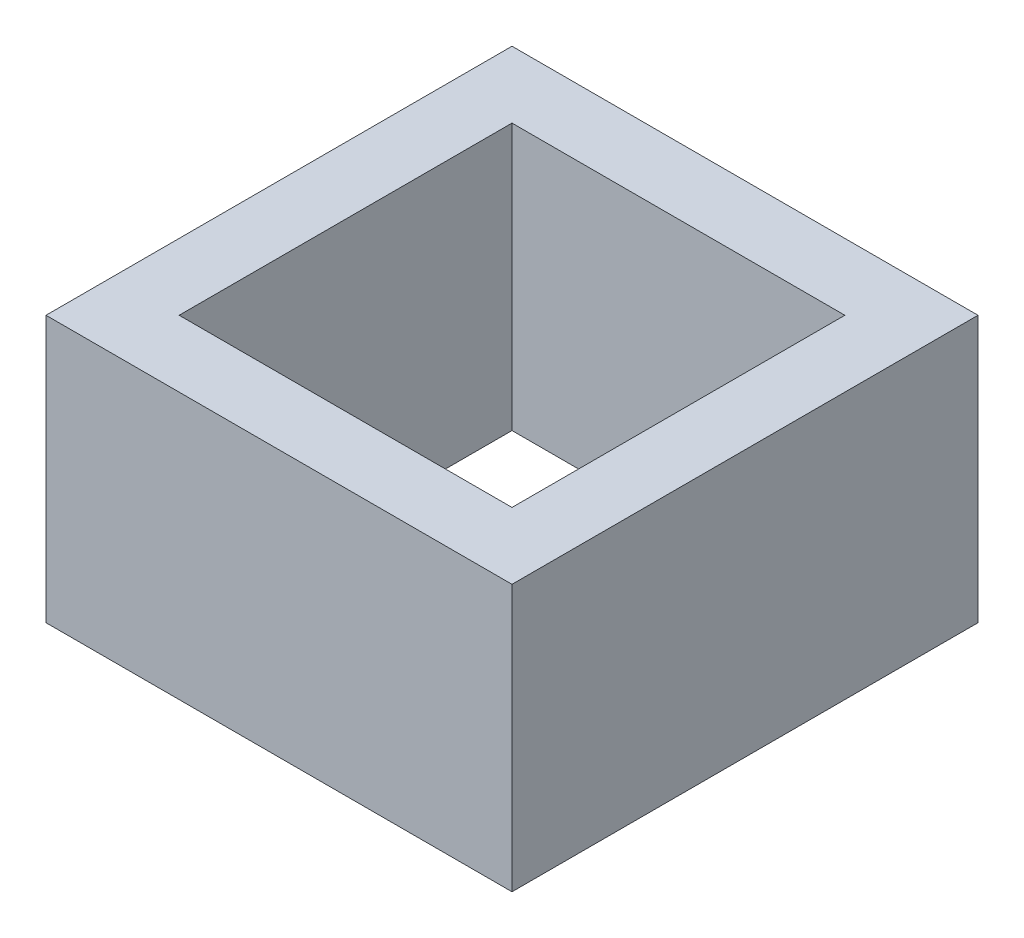
ISO-10303-21;
HEADER;
FILE_DESCRIPTION(('STEP AP214'),'2;1');
FILE_NAME('part.step','',(''),(''),'','','');
FILE_SCHEMA(('AUTOMOTIVE_DESIGN { 1 0 10303 214 1 1 1 1 }'));
ENDSEC;
DATA;
#1=APPLICATION_CONTEXT('core data for automotive mechanical design processes');
#2=APPLICATION_PROTOCOL_DEFINITION('international standard','automotive_design',2000,#1);
#3=PRODUCT_CONTEXT('',#1,'mechanical');
#4=PRODUCT('Part','Part','',(#3));
#5=PRODUCT_RELATED_PRODUCT_CATEGORY('part','',(#4));
#6=PRODUCT_DEFINITION_FORMATION('','',#4);
#7=PRODUCT_DEFINITION_CONTEXT('part definition',#1,'design');
#8=PRODUCT_DEFINITION('design','',#6,#7);
#9=PRODUCT_DEFINITION_SHAPE('','',#8);
#10=(LENGTH_UNIT() NAMED_UNIT(*) SI_UNIT(.MILLI.,.METRE.));
#11=(NAMED_UNIT(*) PLANE_ANGLE_UNIT() SI_UNIT($,.RADIAN.));
#12=(NAMED_UNIT(*) SI_UNIT($,.STERADIAN.) SOLID_ANGLE_UNIT());
#13=UNCERTAINTY_MEASURE_WITH_UNIT(LENGTH_MEASURE(1.E-05),#10,'distance_accuracy_value','');
#14=(GEOMETRIC_REPRESENTATION_CONTEXT(3) GLOBAL_UNCERTAINTY_ASSIGNED_CONTEXT((#13)) GLOBAL_UNIT_ASSIGNED_CONTEXT((#10,
#11,#12)) REPRESENTATION_CONTEXT('',''));
#15=CARTESIAN_POINT('',(0.,0.,0.));
#16=DIRECTION('',(0.,0.,1.));
#17=DIRECTION('',(1.,0.,0.));
#18=AXIS2_PLACEMENT_3D('',#15,#16,#17);
#19=CARTESIAN_POINT('',(0.,20.,0.));
#20=DIRECTION('',(0.,1.,0.));
#21=DIRECTION('',(0.,0.,1.));
#22=AXIS2_PLACEMENT_3D('',#19,#20,#21);
#23=PLANE('',#22);
#24=DIRECTION('',(0.,0.,-1.));
#25=VECTOR('',#24,1.);
#26=CARTESIAN_POINT('',(17.5,20.,-17.5));
#27=LINE('',#26,#25);
#28=CARTESIAN_POINT('',(17.5,20.,17.5));
#29=VERTEX_POINT('',#28);
#30=CARTESIAN_POINT('',(17.5,20.,-17.5));
#31=VERTEX_POINT('',#30);
#32=EDGE_CURVE('E134',#29,#31,#27,.T.);
#33=ORIENTED_EDGE('',*,*,#32,.T.);
#34=DIRECTION('',(-1.,0.,0.));
#35=VECTOR('',#34,1.);
#36=CARTESIAN_POINT('',(-17.5,20.,-17.5));
#37=LINE('',#36,#35);
#38=CARTESIAN_POINT('',(-17.5,20.,-17.5));
#39=VERTEX_POINT('',#38);
#40=EDGE_CURVE('E137',#31,#39,#37,.T.);
#41=ORIENTED_EDGE('',*,*,#40,.T.);
#42=DIRECTION('',(0.,0.,1.));
#43=VECTOR('',#42,1.);
#44=CARTESIAN_POINT('',(-17.5,20.,-17.5));
#45=LINE('',#44,#43);
#46=CARTESIAN_POINT('',(-17.5,20.,17.5));
#47=VERTEX_POINT('',#46);
#48=EDGE_CURVE('E140',#39,#47,#45,.T.);
#49=ORIENTED_EDGE('',*,*,#48,.T.);
#50=DIRECTION('',(1.,0.,0.));
#51=VECTOR('',#50,1.);
#52=CARTESIAN_POINT('',(-17.5,20.,17.5));
#53=LINE('',#52,#51);
#54=EDGE_CURVE('E142',#47,#29,#53,.T.);
#55=ORIENTED_EDGE('',*,*,#54,.T.);
#56=EDGE_LOOP('',(#33,#41,#49,#55));
#57=FACE_BOUND('',#56,.T.);
#58=DIRECTION('',(-1.,0.,0.));
#59=VECTOR('',#58,1.);
#60=CARTESIAN_POINT('',(-12.5,20.,-12.5));
#61=LINE('',#60,#59);
#62=CARTESIAN_POINT('',(12.5,20.,-12.5));
#63=VERTEX_POINT('',#62);
#64=CARTESIAN_POINT('',(-12.5,20.,-12.5));
#65=VERTEX_POINT('',#64);
#66=EDGE_CURVE('E106',#63,#65,#61,.T.);
#67=ORIENTED_EDGE('',*,*,#66,.F.);
#68=DIRECTION('',(0.,0.,-1.));
#69=VECTOR('',#68,1.);
#70=CARTESIAN_POINT('',(12.5,20.,-12.5));
#71=LINE('',#70,#69);
#72=CARTESIAN_POINT('',(12.5,20.,12.5));
#73=VERTEX_POINT('',#72);
#74=EDGE_CURVE('E98',#73,#63,#71,.T.);
#75=ORIENTED_EDGE('',*,*,#74,.F.);
#76=DIRECTION('',(1.,0.,0.));
#77=VECTOR('',#76,1.);
#78=CARTESIAN_POINT('',(-12.5,20.,12.5));
#79=LINE('',#78,#77);
#80=CARTESIAN_POINT('',(-12.5,20.,12.5));
#81=VERTEX_POINT('',#80);
#82=EDGE_CURVE('E120',#81,#73,#79,.T.);
#83=ORIENTED_EDGE('',*,*,#82,.F.);
#84=DIRECTION('',(0.,0.,1.));
#85=VECTOR('',#84,1.);
#86=CARTESIAN_POINT('',(-12.5,20.,-12.5));
#87=LINE('',#86,#85);
#88=EDGE_CURVE('E118',#65,#81,#87,.T.);
#89=ORIENTED_EDGE('',*,*,#88,.F.);
#90=EDGE_LOOP('',(#67,#75,#83,#89));
#91=FACE_BOUND('',#90,.T.);
#92=ADVANCED_FACE('F33',(#57,#91),#23,.T.);
#93=CARTESIAN_POINT('',(0.,0.,0.));
#94=DIRECTION('',(0.,1.,0.));
#95=DIRECTION('',(0.,0.,1.));
#96=AXIS2_PLACEMENT_3D('',#93,#94,#95);
#97=PLANE('',#96);
#98=DIRECTION('',(0.,0.,-1.));
#99=VECTOR('',#98,1.);
#100=CARTESIAN_POINT('',(17.5,0.,-17.5));
#101=LINE('',#100,#99);
#102=CARTESIAN_POINT('',(17.5,0.,17.5));
#103=VERTEX_POINT('',#102);
#104=CARTESIAN_POINT('',(17.5,0.,-17.5));
#105=VERTEX_POINT('',#104);
#106=EDGE_CURVE('E114',#103,#105,#101,.T.);
#107=ORIENTED_EDGE('',*,*,#106,.F.);
#108=DIRECTION('',(1.,0.,0.));
#109=VECTOR('',#108,1.);
#110=CARTESIAN_POINT('',(-17.5,0.,17.5));
#111=LINE('',#110,#109);
#112=CARTESIAN_POINT('',(-17.5,0.,17.5));
#113=VERTEX_POINT('',#112);
#114=EDGE_CURVE('E138',#113,#103,#111,.T.);
#115=ORIENTED_EDGE('',*,*,#114,.F.);
#116=DIRECTION('',(0.,0.,1.));
#117=VECTOR('',#116,1.);
#118=CARTESIAN_POINT('',(-17.5,0.,-17.5));
#119=LINE('',#118,#117);
#120=CARTESIAN_POINT('',(-17.5,0.,-17.5));
#121=VERTEX_POINT('',#120);
#122=EDGE_CURVE('E149',#121,#113,#119,.T.);
#123=ORIENTED_EDGE('',*,*,#122,.F.);
#124=DIRECTION('',(-1.,0.,0.));
#125=VECTOR('',#124,1.);
#126=CARTESIAN_POINT('',(-17.5,0.,-17.5));
#127=LINE('',#126,#125);
#128=EDGE_CURVE('E147',#105,#121,#127,.T.);
#129=ORIENTED_EDGE('',*,*,#128,.F.);
#130=EDGE_LOOP('',(#107,#115,#123,#129));
#131=FACE_BOUND('',#130,.T.);
#132=DIRECTION('',(0.,0.,-1.));
#133=VECTOR('',#132,1.);
#134=CARTESIAN_POINT('',(12.5,0.,-12.5));
#135=LINE('',#134,#133);
#136=CARTESIAN_POINT('',(12.5,0.,12.5));
#137=VERTEX_POINT('',#136);
#138=CARTESIAN_POINT('',(12.5,0.,-12.5));
#139=VERTEX_POINT('',#138);
#140=EDGE_CURVE('E56',#137,#139,#135,.T.);
#141=ORIENTED_EDGE('',*,*,#140,.T.);
#142=DIRECTION('',(-1.,0.,0.));
#143=VECTOR('',#142,1.);
#144=CARTESIAN_POINT('',(-12.5,0.,-12.5));
#145=LINE('',#144,#143);
#146=CARTESIAN_POINT('',(-12.5,0.,-12.5));
#147=VERTEX_POINT('',#146);
#148=EDGE_CURVE('E113',#139,#147,#145,.T.);
#149=ORIENTED_EDGE('',*,*,#148,.T.);
#150=DIRECTION('',(0.,0.,1.));
#151=VECTOR('',#150,1.);
#152=CARTESIAN_POINT('',(-12.5,0.,-12.5));
#153=LINE('',#152,#151);
#154=CARTESIAN_POINT('',(-12.5,0.,12.5));
#155=VERTEX_POINT('',#154);
#156=EDGE_CURVE('E126',#147,#155,#153,.T.);
#157=ORIENTED_EDGE('',*,*,#156,.T.);
#158=DIRECTION('',(1.,0.,0.));
#159=VECTOR('',#158,1.);
#160=CARTESIAN_POINT('',(-12.5,0.,12.5));
#161=LINE('',#160,#159);
#162=EDGE_CURVE('E107',#155,#137,#161,.T.);
#163=ORIENTED_EDGE('',*,*,#162,.T.);
#164=EDGE_LOOP('',(#141,#149,#157,#163));
#165=FACE_BOUND('',#164,.T.);
#166=ADVANCED_FACE('F167',(#131,#165),#97,.F.);
#167=CARTESIAN_POINT('',(17.5,20.,-17.5));
#168=DIRECTION('',(-1.,0.,0.));
#169=DIRECTION('',(0.,0.,1.));
#170=AXIS2_PLACEMENT_3D('',#167,#168,#169);
#171=PLANE('',#170);
#172=ORIENTED_EDGE('',*,*,#106,.T.);
#173=DIRECTION('',(0.,-1.,0.));
#174=VECTOR('',#173,1.);
#175=CARTESIAN_POINT('',(17.5,20.,-17.5));
#176=LINE('',#175,#174);
#177=EDGE_CURVE('E11',#31,#105,#176,.T.);
#178=ORIENTED_EDGE('',*,*,#177,.F.);
#179=ORIENTED_EDGE('',*,*,#32,.F.);
#180=DIRECTION('',(0.,-1.,0.));
#181=VECTOR('',#180,1.);
#182=CARTESIAN_POINT('',(17.5,20.,17.5));
#183=LINE('',#182,#181);
#184=EDGE_CURVE('E144',#29,#103,#183,.T.);
#185=ORIENTED_EDGE('',*,*,#184,.T.);
#186=EDGE_LOOP('',(#172,#178,#179,#185));
#187=FACE_BOUND('',#186,.T.);
#188=ADVANCED_FACE('F35',(#187),#171,.F.);
#189=CARTESIAN_POINT('',(-17.5,20.,-17.5));
#190=DIRECTION('',(0.,0.,1.));
#191=DIRECTION('',(1.,0.,0.));
#192=AXIS2_PLACEMENT_3D('',#189,#190,#191);
#193=PLANE('',#192);
#194=ORIENTED_EDGE('',*,*,#128,.T.);
#195=DIRECTION('',(0.,-1.,0.));
#196=VECTOR('',#195,1.);
#197=CARTESIAN_POINT('',(-17.5,20.,-17.5));
#198=LINE('',#197,#196);
#199=EDGE_CURVE('E41',#39,#121,#198,.T.);
#200=ORIENTED_EDGE('',*,*,#199,.F.);
#201=ORIENTED_EDGE('',*,*,#40,.F.);
#202=ORIENTED_EDGE('',*,*,#177,.T.);
#203=EDGE_LOOP('',(#194,#200,#201,#202));
#204=FACE_BOUND('',#203,.T.);
#205=ADVANCED_FACE('F177',(#204),#193,.F.);
#206=CARTESIAN_POINT('',(-17.5,20.,-17.5));
#207=DIRECTION('',(1.,0.,0.));
#208=DIRECTION('',(0.,0.,-1.));
#209=AXIS2_PLACEMENT_3D('',#206,#207,#208);
#210=PLANE('',#209);
#211=ORIENTED_EDGE('',*,*,#122,.T.);
#212=DIRECTION('',(0.,-1.,0.));
#213=VECTOR('',#212,1.);
#214=CARTESIAN_POINT('',(-17.5,20.,17.5));
#215=LINE('',#214,#213);
#216=EDGE_CURVE('E154',#47,#113,#215,.T.);
#217=ORIENTED_EDGE('',*,*,#216,.F.);
#218=ORIENTED_EDGE('',*,*,#48,.F.);
#219=ORIENTED_EDGE('',*,*,#199,.T.);
#220=EDGE_LOOP('',(#211,#217,#218,#219));
#221=FACE_BOUND('',#220,.T.);
#222=ADVANCED_FACE('F161',(#221),#210,.F.);
#223=CARTESIAN_POINT('',(-17.5,20.,17.5));
#224=DIRECTION('',(0.,0.,-1.));
#225=DIRECTION('',(-1.,0.,0.));
#226=AXIS2_PLACEMENT_3D('',#223,#224,#225);
#227=PLANE('',#226);
#228=ORIENTED_EDGE('',*,*,#114,.T.);
#229=ORIENTED_EDGE('',*,*,#184,.F.);
#230=ORIENTED_EDGE('',*,*,#54,.F.);
#231=ORIENTED_EDGE('',*,*,#216,.T.);
#232=EDGE_LOOP('',(#228,#229,#230,#231));
#233=FACE_BOUND('',#232,.T.);
#234=ADVANCED_FACE('F171',(#233),#227,.F.);
#235=CARTESIAN_POINT('',(12.5,20.,-12.5));
#236=DIRECTION('',(-1.,0.,0.));
#237=DIRECTION('',(0.,0.,1.));
#238=AXIS2_PLACEMENT_3D('',#235,#236,#237);
#239=PLANE('',#238);
#240=ORIENTED_EDGE('',*,*,#140,.F.);
#241=DIRECTION('',(0.,-1.,0.));
#242=VECTOR('',#241,1.);
#243=CARTESIAN_POINT('',(12.5,20.,12.5));
#244=LINE('',#243,#242);
#245=EDGE_CURVE('E102',#73,#137,#244,.T.);
#246=ORIENTED_EDGE('',*,*,#245,.F.);
#247=ORIENTED_EDGE('',*,*,#74,.T.);
#248=DIRECTION('',(0.,-1.,0.));
#249=VECTOR('',#248,1.);
#250=CARTESIAN_POINT('',(12.5,20.,-12.5));
#251=LINE('',#250,#249);
#252=EDGE_CURVE('E101',#63,#139,#251,.T.);
#253=ORIENTED_EDGE('',*,*,#252,.T.);
#254=EDGE_LOOP('',(#240,#246,#247,#253));
#255=FACE_BOUND('',#254,.T.);
#256=ADVANCED_FACE('F100',(#255),#239,.T.);
#257=CARTESIAN_POINT('',(-12.5,20.,-12.5));
#258=DIRECTION('',(0.,0.,1.));
#259=DIRECTION('',(1.,0.,0.));
#260=AXIS2_PLACEMENT_3D('',#257,#258,#259);
#261=PLANE('',#260);
#262=ORIENTED_EDGE('',*,*,#148,.F.);
#263=ORIENTED_EDGE('',*,*,#252,.F.);
#264=ORIENTED_EDGE('',*,*,#66,.T.);
#265=DIRECTION('',(0.,-1.,0.));
#266=VECTOR('',#265,1.);
#267=CARTESIAN_POINT('',(-12.5,20.,-12.5));
#268=LINE('',#267,#266);
#269=EDGE_CURVE('E115',#65,#147,#268,.T.);
#270=ORIENTED_EDGE('',*,*,#269,.T.);
#271=EDGE_LOOP('',(#262,#263,#264,#270));
#272=FACE_BOUND('',#271,.T.);
#273=ADVANCED_FACE('F110',(#272),#261,.T.);
#274=CARTESIAN_POINT('',(-12.5,20.,-12.5));
#275=DIRECTION('',(1.,0.,0.));
#276=DIRECTION('',(0.,0.,-1.));
#277=AXIS2_PLACEMENT_3D('',#274,#275,#276);
#278=PLANE('',#277);
#279=ORIENTED_EDGE('',*,*,#156,.F.);
#280=ORIENTED_EDGE('',*,*,#269,.F.);
#281=ORIENTED_EDGE('',*,*,#88,.T.);
#282=DIRECTION('',(0.,-1.,0.));
#283=VECTOR('',#282,1.);
#284=CARTESIAN_POINT('',(-12.5,20.,12.5));
#285=LINE('',#284,#283);
#286=EDGE_CURVE('E48',#81,#155,#285,.T.);
#287=ORIENTED_EDGE('',*,*,#286,.T.);
#288=EDGE_LOOP('',(#279,#280,#281,#287));
#289=FACE_BOUND('',#288,.T.);
#290=ADVANCED_FACE('F200',(#289),#278,.T.);
#291=CARTESIAN_POINT('',(-12.5,20.,12.5));
#292=DIRECTION('',(0.,0.,-1.));
#293=DIRECTION('',(-1.,0.,0.));
#294=AXIS2_PLACEMENT_3D('',#291,#292,#293);
#295=PLANE('',#294);
#296=ORIENTED_EDGE('',*,*,#162,.F.);
#297=ORIENTED_EDGE('',*,*,#286,.F.);
#298=ORIENTED_EDGE('',*,*,#82,.T.);
#299=ORIENTED_EDGE('',*,*,#245,.T.);
#300=EDGE_LOOP('',(#296,#297,#298,#299));
#301=FACE_BOUND('',#300,.T.);
#302=ADVANCED_FACE('F204',(#301),#295,.T.);
#303=CLOSED_SHELL('',(#92,#166,#188,#205,#222,#234,#256,#273,#290,#302));
#304=MANIFOLD_SOLID_BREP('B2',#303);
#305=ADVANCED_BREP_SHAPE_REPRESENTATION('',(#18,#304),#14);
#306=SHAPE_DEFINITION_REPRESENTATION(#9,#305);
ENDSEC;
END-ISO-10303-21;
